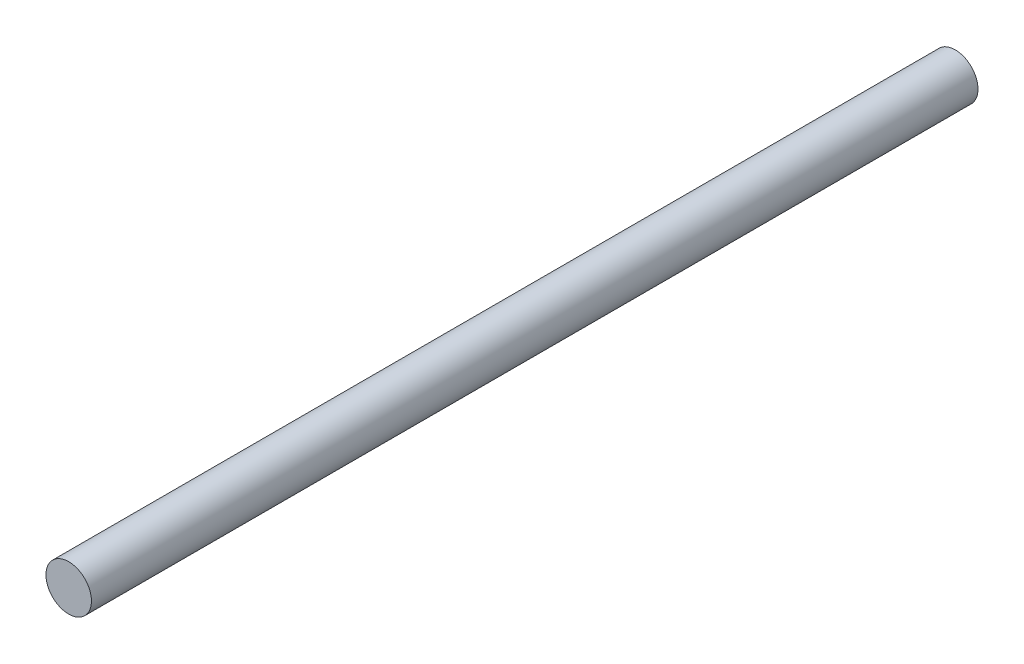
ISO-10303-21;
HEADER;
FILE_DESCRIPTION(('STEP AP214'),'2;1');
FILE_NAME('part.step','',(''),(''),'','','');
FILE_SCHEMA(('AUTOMOTIVE_DESIGN { 1 0 10303 214 1 1 1 1 }'));
ENDSEC;
DATA;
#1=APPLICATION_CONTEXT('core data for automotive mechanical design processes');
#2=APPLICATION_PROTOCOL_DEFINITION('international standard','automotive_design',2000,#1);
#3=PRODUCT_CONTEXT('',#1,'mechanical');
#4=PRODUCT('Part','Part','',(#3));
#5=PRODUCT_RELATED_PRODUCT_CATEGORY('part','',(#4));
#6=PRODUCT_DEFINITION_FORMATION('','',#4);
#7=PRODUCT_DEFINITION_CONTEXT('part definition',#1,'design');
#8=PRODUCT_DEFINITION('design','',#6,#7);
#9=PRODUCT_DEFINITION_SHAPE('','',#8);
#10=(LENGTH_UNIT() NAMED_UNIT(*) SI_UNIT(.MILLI.,.METRE.));
#11=(NAMED_UNIT(*) PLANE_ANGLE_UNIT() SI_UNIT($,.RADIAN.));
#12=(NAMED_UNIT(*) SI_UNIT($,.STERADIAN.) SOLID_ANGLE_UNIT());
#13=UNCERTAINTY_MEASURE_WITH_UNIT(LENGTH_MEASURE(1.E-05),#10,'distance_accuracy_value','');
#14=(GEOMETRIC_REPRESENTATION_CONTEXT(3) GLOBAL_UNCERTAINTY_ASSIGNED_CONTEXT((#13)) GLOBAL_UNIT_ASSIGNED_CONTEXT((#10,
#11,#12)) REPRESENTATION_CONTEXT('',''));
#15=CARTESIAN_POINT('',(0.,0.,0.));
#16=DIRECTION('',(0.,0.,1.));
#17=DIRECTION('',(1.,0.,0.));
#18=AXIS2_PLACEMENT_3D('',#15,#16,#17);
#19=CARTESIAN_POINT('',(0.,0.,-390.));
#20=DIRECTION('',(0.,0.,1.));
#21=DIRECTION('',(1.,0.,0.));
#22=AXIS2_PLACEMENT_3D('',#19,#20,#21);
#23=CYLINDRICAL_SURFACE('',#22,10.);
#24=CARTESIAN_POINT('',(0.,0.,-390.));
#25=DIRECTION('',(0.,0.,1.));
#26=DIRECTION('',(1.,0.,0.));
#27=AXIS2_PLACEMENT_3D('',#24,#25,#26);
#28=CIRCLE('',#27,10.);
#29=CARTESIAN_POINT('',(10.,0.,-390.));
#30=VERTEX_POINT('',#29);
#31=EDGE_CURVE('E10',#30,#30,#28,.T.);
#32=ORIENTED_EDGE('',*,*,#31,.T.);
#33=EDGE_LOOP('',(#32));
#34=FACE_BOUND('',#33,.T.);
#35=CARTESIAN_POINT('',(0.,0.,0.));
#36=DIRECTION('',(0.,0.,1.));
#37=DIRECTION('',(1.,0.,0.));
#38=AXIS2_PLACEMENT_3D('',#35,#36,#37);
#39=CIRCLE('',#38,10.);
#40=CARTESIAN_POINT('',(10.,0.,0.));
#41=VERTEX_POINT('',#40);
#42=EDGE_CURVE('E40',#41,#41,#39,.T.);
#43=ORIENTED_EDGE('',*,*,#42,.F.);
#44=EDGE_LOOP('',(#43));
#45=FACE_BOUND('',#44,.T.);
#46=ADVANCED_FACE('F37',(#34,#45),#23,.T.);
#47=CARTESIAN_POINT('',(0.,0.,-390.));
#48=DIRECTION('',(0.,0.,1.));
#49=DIRECTION('',(1.,0.,0.));
#50=AXIS2_PLACEMENT_3D('',#47,#48,#49);
#51=PLANE('',#50);
#52=ORIENTED_EDGE('',*,*,#31,.F.);
#53=EDGE_LOOP('',(#52));
#54=FACE_BOUND('',#53,.T.);
#55=ADVANCED_FACE('F52',(#54),#51,.F.);
#56=CARTESIAN_POINT('',(0.,0.,0.));
#57=DIRECTION('',(0.,0.,1.));
#58=DIRECTION('',(1.,0.,0.));
#59=AXIS2_PLACEMENT_3D('',#56,#57,#58);
#60=PLANE('',#59);
#61=ORIENTED_EDGE('',*,*,#42,.T.);
#62=EDGE_LOOP('',(#61));
#63=FACE_BOUND('',#62,.T.);
#64=ADVANCED_FACE('F49',(#63),#60,.T.);
#65=CLOSED_SHELL('',(#46,#55,#64));
#66=MANIFOLD_SOLID_BREP('B2',#65);
#67=ADVANCED_BREP_SHAPE_REPRESENTATION('',(#18,#66),#14);
#68=SHAPE_DEFINITION_REPRESENTATION(#9,#67);
ENDSEC;
END-ISO-10303-21;
